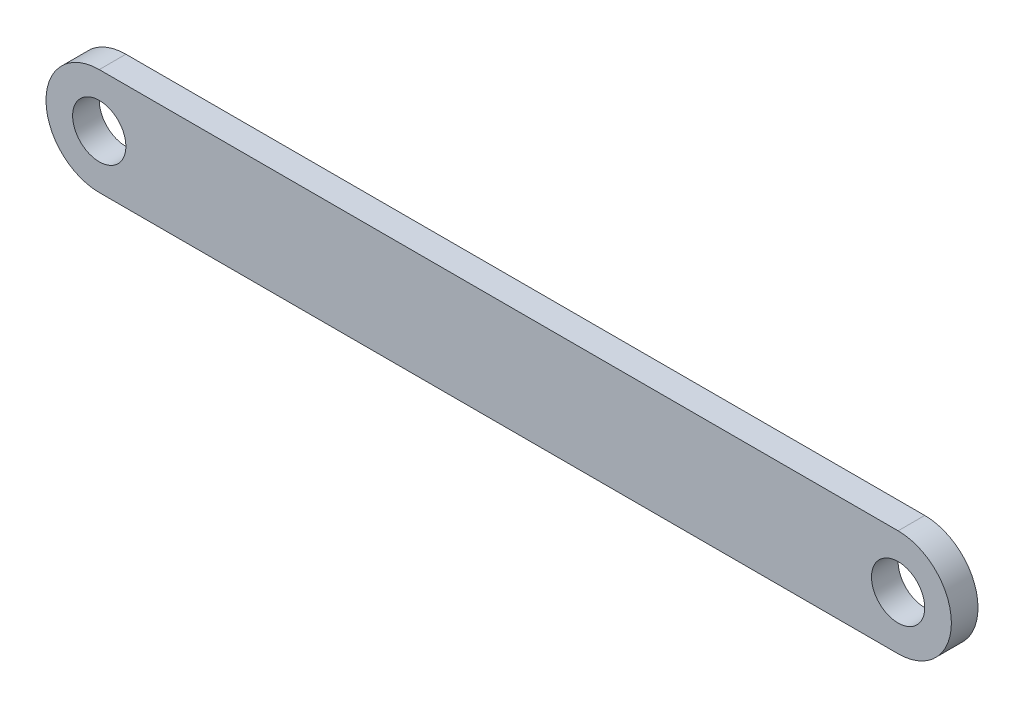
ISO-10303-21;
HEADER;
FILE_DESCRIPTION(('STEP AP214'),'2;1');
FILE_NAME('part.step','',(''),(''),'','','');
FILE_SCHEMA(('AUTOMOTIVE_DESIGN { 1 0 10303 214 1 1 1 1 }'));
ENDSEC;
DATA;
#1=APPLICATION_CONTEXT('core data for automotive mechanical design processes');
#2=APPLICATION_PROTOCOL_DEFINITION('international standard','automotive_design',2000,#1);
#3=PRODUCT_CONTEXT('',#1,'mechanical');
#4=PRODUCT('Part','Part','',(#3));
#5=PRODUCT_RELATED_PRODUCT_CATEGORY('part','',(#4));
#6=PRODUCT_DEFINITION_FORMATION('','',#4);
#7=PRODUCT_DEFINITION_CONTEXT('part definition',#1,'design');
#8=PRODUCT_DEFINITION('design','',#6,#7);
#9=PRODUCT_DEFINITION_SHAPE('','',#8);
#10=(LENGTH_UNIT() NAMED_UNIT(*) SI_UNIT(.MILLI.,.METRE.));
#11=(NAMED_UNIT(*) PLANE_ANGLE_UNIT() SI_UNIT($,.RADIAN.));
#12=(NAMED_UNIT(*) SI_UNIT($,.STERADIAN.) SOLID_ANGLE_UNIT());
#13=UNCERTAINTY_MEASURE_WITH_UNIT(LENGTH_MEASURE(1.E-05),#10,'distance_accuracy_value','');
#14=(GEOMETRIC_REPRESENTATION_CONTEXT(3) GLOBAL_UNCERTAINTY_ASSIGNED_CONTEXT((#13)) GLOBAL_UNIT_ASSIGNED_CONTEXT((#10,
#11,#12)) REPRESENTATION_CONTEXT('',''));
#15=CARTESIAN_POINT('',(0.,0.,0.));
#16=DIRECTION('',(0.,0.,1.));
#17=DIRECTION('',(1.,0.,0.));
#18=AXIS2_PLACEMENT_3D('',#15,#16,#17);
#19=CARTESIAN_POINT('',(-476.25,0.157439451623581,15.875));
#20=DIRECTION('',(0.,0.,1.));
#21=DIRECTION('',(1.,0.,0.));
#22=AXIS2_PLACEMENT_3D('',#19,#20,#21);
#23=PLANE('',#22);
#24=CARTESIAN_POINT('',(-476.25,0.157439451623581,15.875));
#25=DIRECTION('',(0.,0.,1.));
#26=DIRECTION('',(1.,0.,0.));
#27=AXIS2_PLACEMENT_3D('',#24,#25,#26);
#28=CIRCLE('',#27,31.75);
#29=CARTESIAN_POINT('',(-444.5,0.157439451623581,15.875));
#30=VERTEX_POINT('',#29);
#31=EDGE_CURVE('E104',#30,#30,#28,.T.);
#32=ORIENTED_EDGE('',*,*,#31,.F.);
#33=EDGE_LOOP('',(#32));
#34=FACE_BOUND('',#33,.T.);
#35=CARTESIAN_POINT('',(-476.25,0.157439451623581,15.875));
#36=DIRECTION('',(0.,0.,1.));
#37=DIRECTION('',(1.,0.,0.));
#38=AXIS2_PLACEMENT_3D('',#35,#36,#37);
#39=CIRCLE('',#38,63.5);
#40=CARTESIAN_POINT('',(-476.25,63.6574394516236,15.875));
#41=VERTEX_POINT('',#40);
#42=CARTESIAN_POINT('',(-476.25,-63.3425605483764,15.875));
#43=VERTEX_POINT('',#42);
#44=EDGE_CURVE('E89',#41,#43,#39,.T.);
#45=ORIENTED_EDGE('',*,*,#44,.T.);
#46=DIRECTION('',(1.,0.,0.));
#47=VECTOR('',#46,1.);
#48=CARTESIAN_POINT('',(-476.25,-63.3425605483764,15.875));
#49=LINE('',#48,#47);
#50=CARTESIAN_POINT('',(476.25,-63.3425605483764,15.875));
#51=VERTEX_POINT('',#50);
#52=EDGE_CURVE('E84',#43,#51,#49,.T.);
#53=ORIENTED_EDGE('',*,*,#52,.T.);
#54=CARTESIAN_POINT('',(476.25,0.157439451623581,15.875));
#55=DIRECTION('',(0.,0.,1.));
#56=DIRECTION('',(1.,0.,0.));
#57=AXIS2_PLACEMENT_3D('',#54,#55,#56);
#58=CIRCLE('',#57,63.5);
#59=CARTESIAN_POINT('',(476.25,63.6574394516236,15.875));
#60=VERTEX_POINT('',#59);
#61=EDGE_CURVE('E87',#51,#60,#58,.T.);
#62=ORIENTED_EDGE('',*,*,#61,.T.);
#63=DIRECTION('',(-1.,0.,0.));
#64=VECTOR('',#63,1.);
#65=CARTESIAN_POINT('',(-476.25,63.6574394516236,15.875));
#66=LINE('',#65,#64);
#67=EDGE_CURVE('E54',#60,#41,#66,.T.);
#68=ORIENTED_EDGE('',*,*,#67,.T.);
#69=EDGE_LOOP('',(#45,#53,#62,#68));
#70=FACE_BOUND('',#69,.T.);
#71=CARTESIAN_POINT('',(476.25,0.157439451623581,15.875));
#72=DIRECTION('',(0.,0.,1.));
#73=DIRECTION('',(1.,0.,0.));
#74=AXIS2_PLACEMENT_3D('',#71,#72,#73);
#75=CIRCLE('',#74,31.75);
#76=CARTESIAN_POINT('',(508.,0.157439451623581,15.875));
#77=VERTEX_POINT('',#76);
#78=EDGE_CURVE('E119',#77,#77,#75,.T.);
#79=ORIENTED_EDGE('',*,*,#78,.F.);
#80=EDGE_LOOP('',(#79));
#81=FACE_BOUND('',#80,.T.);
#82=ADVANCED_FACE('F37',(#34,#70,#81),#23,.T.);
#83=CARTESIAN_POINT('',(-476.25,0.157439451623581,-15.875));
#84=DIRECTION('',(0.,0.,1.));
#85=DIRECTION('',(1.,0.,0.));
#86=AXIS2_PLACEMENT_3D('',#83,#84,#85);
#87=PLANE('',#86);
#88=CARTESIAN_POINT('',(-476.25,0.157439451623581,-15.875));
#89=DIRECTION('',(0.,0.,1.));
#90=DIRECTION('',(1.,0.,0.));
#91=AXIS2_PLACEMENT_3D('',#88,#89,#90);
#92=CIRCLE('',#91,31.75);
#93=CARTESIAN_POINT('',(-444.5,0.157439451623581,-15.875));
#94=VERTEX_POINT('',#93);
#95=EDGE_CURVE('E116',#94,#94,#92,.T.);
#96=ORIENTED_EDGE('',*,*,#95,.T.);
#97=EDGE_LOOP('',(#96));
#98=FACE_BOUND('',#97,.T.);
#99=CARTESIAN_POINT('',(-476.25,0.157439451623581,-15.875));
#100=DIRECTION('',(0.,0.,1.));
#101=DIRECTION('',(1.,0.,0.));
#102=AXIS2_PLACEMENT_3D('',#99,#100,#101);
#103=CIRCLE('',#102,63.5);
#104=CARTESIAN_POINT('',(-476.25,63.6574394516236,-15.875));
#105=VERTEX_POINT('',#104);
#106=CARTESIAN_POINT('',(-476.25,-63.3425605483764,-15.875));
#107=VERTEX_POINT('',#106);
#108=EDGE_CURVE('E101',#105,#107,#103,.T.);
#109=ORIENTED_EDGE('',*,*,#108,.F.);
#110=DIRECTION('',(-1.,0.,0.));
#111=VECTOR('',#110,1.);
#112=CARTESIAN_POINT('',(-476.25,63.6574394516236,-15.875));
#113=LINE('',#112,#111);
#114=CARTESIAN_POINT('',(476.25,63.6574394516236,-15.875));
#115=VERTEX_POINT('',#114);
#116=EDGE_CURVE('E77',#115,#105,#113,.T.);
#117=ORIENTED_EDGE('',*,*,#116,.F.);
#118=CARTESIAN_POINT('',(476.25,0.157439451623581,-15.875));
#119=DIRECTION('',(0.,0.,1.));
#120=DIRECTION('',(1.,0.,0.));
#121=AXIS2_PLACEMENT_3D('',#118,#119,#120);
#122=CIRCLE('',#121,63.5);
#123=CARTESIAN_POINT('',(476.25,-63.3425605483764,-15.875));
#124=VERTEX_POINT('',#123);
#125=EDGE_CURVE('E71',#124,#115,#122,.T.);
#126=ORIENTED_EDGE('',*,*,#125,.F.);
#127=DIRECTION('',(1.,0.,0.));
#128=VECTOR('',#127,1.);
#129=CARTESIAN_POINT('',(-476.25,-63.3425605483764,-15.875));
#130=LINE('',#129,#128);
#131=EDGE_CURVE('E93',#107,#124,#130,.T.);
#132=ORIENTED_EDGE('',*,*,#131,.F.);
#133=EDGE_LOOP('',(#109,#117,#126,#132));
#134=FACE_BOUND('',#133,.T.);
#135=CARTESIAN_POINT('',(476.25,0.157439451623581,-15.875));
#136=DIRECTION('',(0.,0.,1.));
#137=DIRECTION('',(1.,0.,0.));
#138=AXIS2_PLACEMENT_3D('',#135,#136,#137);
#139=CIRCLE('',#138,31.75);
#140=CARTESIAN_POINT('',(508.,0.157439451623581,-15.875));
#141=VERTEX_POINT('',#140);
#142=EDGE_CURVE('E122',#141,#141,#139,.T.);
#143=ORIENTED_EDGE('',*,*,#142,.T.);
#144=EDGE_LOOP('',(#143));
#145=FACE_BOUND('',#144,.T.);
#146=ADVANCED_FACE('F112',(#98,#134,#145),#87,.F.);
#147=CARTESIAN_POINT('',(-476.25,0.157439451623581,15.875));
#148=DIRECTION('',(0.,0.,-1.));
#149=DIRECTION('',(-1.,0.,0.));
#150=AXIS2_PLACEMENT_3D('',#147,#148,#149);
#151=CYLINDRICAL_SURFACE('',#150,63.5);
#152=ORIENTED_EDGE('',*,*,#108,.T.);
#153=DIRECTION('',(0.,0.,-1.));
#154=VECTOR('',#153,1.);
#155=CARTESIAN_POINT('',(-476.25,-63.3425605483764,15.875));
#156=LINE('',#155,#154);
#157=EDGE_CURVE('E11',#43,#107,#156,.T.);
#158=ORIENTED_EDGE('',*,*,#157,.F.);
#159=ORIENTED_EDGE('',*,*,#44,.F.);
#160=DIRECTION('',(0.,0.,-1.));
#161=VECTOR('',#160,1.);
#162=CARTESIAN_POINT('',(-476.25,63.6574394516236,15.875));
#163=LINE('',#162,#161);
#164=EDGE_CURVE('E97',#41,#105,#163,.T.);
#165=ORIENTED_EDGE('',*,*,#164,.T.);
#166=EDGE_LOOP('',(#152,#158,#159,#165));
#167=FACE_BOUND('',#166,.T.);
#168=ADVANCED_FACE('F39',(#167),#151,.T.);
#169=CARTESIAN_POINT('',(-476.25,-63.3425605483764,15.875));
#170=DIRECTION('',(0.,1.,0.));
#171=DIRECTION('',(0.,0.,1.));
#172=AXIS2_PLACEMENT_3D('',#169,#170,#171);
#173=PLANE('',#172);
#174=ORIENTED_EDGE('',*,*,#131,.T.);
#175=DIRECTION('',(0.,0.,-1.));
#176=VECTOR('',#175,1.);
#177=CARTESIAN_POINT('',(476.25,-63.3425605483764,15.875));
#178=LINE('',#177,#176);
#179=EDGE_CURVE('E46',#51,#124,#178,.T.);
#180=ORIENTED_EDGE('',*,*,#179,.F.);
#181=ORIENTED_EDGE('',*,*,#52,.F.);
#182=ORIENTED_EDGE('',*,*,#157,.T.);
#183=EDGE_LOOP('',(#174,#180,#181,#182));
#184=FACE_BOUND('',#183,.T.);
#185=ADVANCED_FACE('F92',(#184),#173,.F.);
#186=CARTESIAN_POINT('',(476.25,0.157439451623581,15.875));
#187=DIRECTION('',(0.,0.,-1.));
#188=DIRECTION('',(-1.,0.,0.));
#189=AXIS2_PLACEMENT_3D('',#186,#187,#188);
#190=CYLINDRICAL_SURFACE('',#189,63.5);
#191=ORIENTED_EDGE('',*,*,#125,.T.);
#192=DIRECTION('',(0.,0.,-1.));
#193=VECTOR('',#192,1.);
#194=CARTESIAN_POINT('',(476.25,63.6574394516236,15.875));
#195=LINE('',#194,#193);
#196=EDGE_CURVE('E94',#60,#115,#195,.T.);
#197=ORIENTED_EDGE('',*,*,#196,.F.);
#198=ORIENTED_EDGE('',*,*,#61,.F.);
#199=ORIENTED_EDGE('',*,*,#179,.T.);
#200=EDGE_LOOP('',(#191,#197,#198,#199));
#201=FACE_BOUND('',#200,.T.);
#202=ADVANCED_FACE('F95',(#201),#190,.T.);
#203=CARTESIAN_POINT('',(-476.25,63.6574394516236,15.875));
#204=DIRECTION('',(0.,-1.,0.));
#205=DIRECTION('',(0.,0.,-1.));
#206=AXIS2_PLACEMENT_3D('',#203,#204,#205);
#207=PLANE('',#206);
#208=ORIENTED_EDGE('',*,*,#116,.T.);
#209=ORIENTED_EDGE('',*,*,#164,.F.);
#210=ORIENTED_EDGE('',*,*,#67,.F.);
#211=ORIENTED_EDGE('',*,*,#196,.T.);
#212=EDGE_LOOP('',(#208,#209,#210,#211));
#213=FACE_BOUND('',#212,.T.);
#214=ADVANCED_FACE('F109',(#213),#207,.F.);
#215=CARTESIAN_POINT('',(-476.25,0.157439451623581,15.875));
#216=DIRECTION('',(0.,0.,-1.));
#217=DIRECTION('',(-1.,0.,0.));
#218=AXIS2_PLACEMENT_3D('',#215,#216,#217);
#219=CYLINDRICAL_SURFACE('',#218,31.75);
#220=ORIENTED_EDGE('',*,*,#31,.T.);
#221=EDGE_LOOP('',(#220));
#222=FACE_BOUND('',#221,.T.);
#223=ORIENTED_EDGE('',*,*,#95,.F.);
#224=EDGE_LOOP('',(#223));
#225=FACE_BOUND('',#224,.T.);
#226=ADVANCED_FACE('F140',(#222,#225),#219,.F.);
#227=CARTESIAN_POINT('',(476.25,0.157439451623581,15.875));
#228=DIRECTION('',(0.,0.,-1.));
#229=DIRECTION('',(-1.,0.,0.));
#230=AXIS2_PLACEMENT_3D('',#227,#228,#229);
#231=CYLINDRICAL_SURFACE('',#230,31.75);
#232=ORIENTED_EDGE('',*,*,#78,.T.);
#233=EDGE_LOOP('',(#232));
#234=FACE_BOUND('',#233,.T.);
#235=ORIENTED_EDGE('',*,*,#142,.F.);
#236=EDGE_LOOP('',(#235));
#237=FACE_BOUND('',#236,.T.);
#238=ADVANCED_FACE('F128',(#234,#237),#231,.F.);
#239=CLOSED_SHELL('',(#82,#146,#168,#185,#202,#214,#226,#238));
#240=MANIFOLD_SOLID_BREP('B2',#239);
#241=ADVANCED_BREP_SHAPE_REPRESENTATION('',(#18,#240),#14);
#242=SHAPE_DEFINITION_REPRESENTATION(#9,#241);
ENDSEC;
END-ISO-10303-21;
